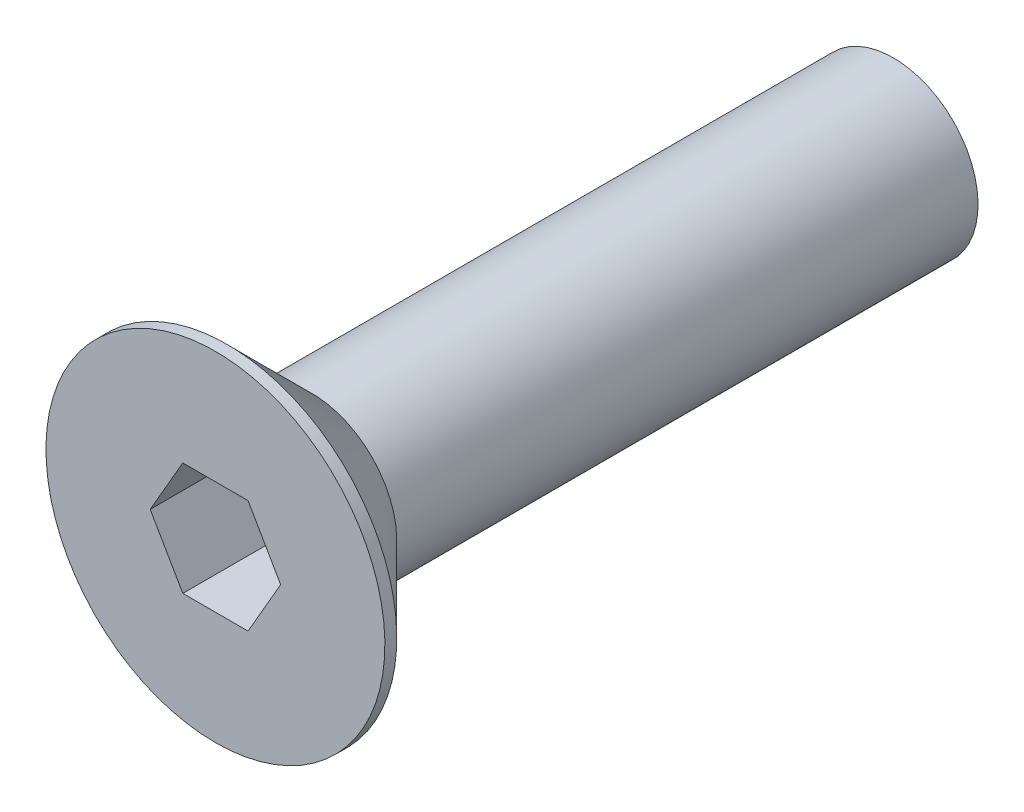
ISO-10303-21;
HEADER;
FILE_DESCRIPTION(('STEP AP214'),'2;1');
FILE_NAME('part.step','',(''),(''),'','','');
FILE_SCHEMA(('AUTOMOTIVE_DESIGN { 1 0 10303 214 1 1 1 1 }'));
ENDSEC;
DATA;
#1=APPLICATION_CONTEXT('core data for automotive mechanical design processes');
#2=APPLICATION_PROTOCOL_DEFINITION('international standard','automotive_design',2000,#1);
#3=PRODUCT_CONTEXT('',#1,'mechanical');
#4=PRODUCT('Part','Part','',(#3));
#5=PRODUCT_RELATED_PRODUCT_CATEGORY('part','',(#4));
#6=PRODUCT_DEFINITION_FORMATION('','',#4);
#7=PRODUCT_DEFINITION_CONTEXT('part definition',#1,'design');
#8=PRODUCT_DEFINITION('design','',#6,#7);
#9=PRODUCT_DEFINITION_SHAPE('','',#8);
#10=(LENGTH_UNIT() NAMED_UNIT(*) SI_UNIT(.MILLI.,.METRE.));
#11=(NAMED_UNIT(*) PLANE_ANGLE_UNIT() SI_UNIT($,.RADIAN.));
#12=(NAMED_UNIT(*) SI_UNIT($,.STERADIAN.) SOLID_ANGLE_UNIT());
#13=UNCERTAINTY_MEASURE_WITH_UNIT(LENGTH_MEASURE(1.E-05),#10,'distance_accuracy_value','');
#14=(GEOMETRIC_REPRESENTATION_CONTEXT(3) GLOBAL_UNCERTAINTY_ASSIGNED_CONTEXT((#13)) GLOBAL_UNIT_ASSIGNED_CONTEXT((#10,
#11,#12)) REPRESENTATION_CONTEXT('',''));
#15=CARTESIAN_POINT('',(0.,0.,0.));
#16=DIRECTION('',(0.,0.,1.));
#17=DIRECTION('',(1.,0.,0.));
#18=AXIS2_PLACEMENT_3D('',#15,#16,#17);
#19=CARTESIAN_POINT('',(0.,0.,1.7));
#20=DIRECTION('',(0.,0.,-1.));
#21=DIRECTION('',(0.,1.,0.));
#22=AXIS2_PLACEMENT_3D('',#19,#20,#21);
#23=PLANE('',#22);
#24=DIRECTION('',(0.5,0.866025403784439,0.));
#25=VECTOR('',#24,1.);
#26=CARTESIAN_POINT('',(0.577350269189626,-1.,1.7));
#27=LINE('',#26,#25);
#28=CARTESIAN_POINT('',(0.577350269189626,-1.,1.7));
#29=VERTEX_POINT('',#28);
#30=CARTESIAN_POINT('',(1.15470053837925,0.,1.7));
#31=VERTEX_POINT('',#30);
#32=EDGE_CURVE('E124',#29,#31,#27,.T.);
#33=ORIENTED_EDGE('',*,*,#32,.F.);
#34=DIRECTION('',(1.,0.,0.));
#35=VECTOR('',#34,1.);
#36=CARTESIAN_POINT('',(-0.577350269189626,-1.,1.7));
#37=LINE('',#36,#35);
#38=CARTESIAN_POINT('',(-0.577350269189626,-1.,1.7));
#39=VERTEX_POINT('',#38);
#40=EDGE_CURVE('E50',#39,#29,#37,.T.);
#41=ORIENTED_EDGE('',*,*,#40,.F.);
#42=DIRECTION('',(0.5,-0.866025403784439,0.));
#43=VECTOR('',#42,1.);
#44=CARTESIAN_POINT('',(-1.15470053837925,0.,1.7));
#45=LINE('',#44,#43);
#46=CARTESIAN_POINT('',(-1.15470053837925,0.,1.7));
#47=VERTEX_POINT('',#46);
#48=EDGE_CURVE('E133',#47,#39,#45,.T.);
#49=ORIENTED_EDGE('',*,*,#48,.F.);
#50=DIRECTION('',(-0.5,-0.866025403784439,0.));
#51=VECTOR('',#50,1.);
#52=CARTESIAN_POINT('',(-0.577350269189626,1.,1.7));
#53=LINE('',#52,#51);
#54=CARTESIAN_POINT('',(-0.577350269189626,1.,1.7));
#55=VERTEX_POINT('',#54);
#56=EDGE_CURVE('E131',#55,#47,#53,.T.);
#57=ORIENTED_EDGE('',*,*,#56,.F.);
#58=DIRECTION('',(-1.,0.,0.));
#59=VECTOR('',#58,1.);
#60=CARTESIAN_POINT('',(0.577350269189626,1.,1.7));
#61=LINE('',#60,#59);
#62=CARTESIAN_POINT('',(0.577350269189626,1.,1.7));
#63=VERTEX_POINT('',#62);
#64=EDGE_CURVE('E98',#63,#55,#61,.T.);
#65=ORIENTED_EDGE('',*,*,#64,.F.);
#66=DIRECTION('',(-0.5,0.866025403784439,0.));
#67=VECTOR('',#66,1.);
#68=CARTESIAN_POINT('',(1.15470053837925,0.,1.7));
#69=LINE('',#68,#67);
#70=EDGE_CURVE('E127',#31,#63,#69,.T.);
#71=ORIENTED_EDGE('',*,*,#70,.F.);
#72=EDGE_LOOP('',(#33,#41,#49,#57,#65,#71));
#73=FACE_BOUND('',#72,.T.);
#74=CARTESIAN_POINT('',(0.,0.,1.7));
#75=DIRECTION('',(0.,0.,1.));
#76=DIRECTION('',(0.,-1.,0.));
#77=AXIS2_PLACEMENT_3D('',#74,#75,#76);
#78=CIRCLE('',#77,3.);
#79=CARTESIAN_POINT('',(0.,-3.,1.7));
#80=VERTEX_POINT('',#79);
#81=EDGE_CURVE('E11',#80,#80,#78,.T.);
#82=ORIENTED_EDGE('',*,*,#81,.T.);
#83=EDGE_LOOP('',(#82));
#84=FACE_BOUND('',#83,.T.);
#85=ADVANCED_FACE('F36',(#73,#84),#23,.F.);
#86=CARTESIAN_POINT('',(0.,0.,5.58488227818494));
#87=DIRECTION('',(0.,0.,1.));
#88=DIRECTION('',(0.,-1.,0.));
#89=AXIS2_PLACEMENT_3D('',#86,#87,#88);
#90=CYLINDRICAL_SURFACE('',#89,3.);
#91=ORIENTED_EDGE('',*,*,#81,.F.);
#92=EDGE_LOOP('',(#91));
#93=FACE_BOUND('',#92,.T.);
#94=CARTESIAN_POINT('',(0.,0.,1.49000000000002));
#95=DIRECTION('',(0.,0.,1.));
#96=DIRECTION('',(0.,-1.,0.));
#97=AXIS2_PLACEMENT_3D('',#94,#95,#96);
#98=CIRCLE('',#97,3.);
#99=CARTESIAN_POINT('',(0.,-3.,1.49000000000002));
#100=VERTEX_POINT('',#99);
#101=EDGE_CURVE('E43',#100,#100,#98,.T.);
#102=ORIENTED_EDGE('',*,*,#101,.T.);
#103=EDGE_LOOP('',(#102));
#104=FACE_BOUND('',#103,.T.);
#105=ADVANCED_FACE('F153',(#93,#104),#90,.T.);
#106=CARTESIAN_POINT('',(0.,0.,0.));
#107=DIRECTION('',(0.,0.,1.));
#108=DIRECTION('',(0.,-1.,0.));
#109=AXIS2_PLACEMENT_3D('',#106,#107,#108);
#110=CONICAL_SURFACE('',#109,1.51,0.785398163397443);
#111=ORIENTED_EDGE('',*,*,#101,.F.);
#112=EDGE_LOOP('',(#111));
#113=FACE_BOUND('',#112,.T.);
#114=CARTESIAN_POINT('',(0.,0.,0.));
#115=DIRECTION('',(0.,0.,1.));
#116=DIRECTION('',(0.,-1.,0.));
#117=AXIS2_PLACEMENT_3D('',#114,#115,#116);
#118=CIRCLE('',#117,1.51);
#119=CARTESIAN_POINT('',(0.,-1.51,0.));
#120=VERTEX_POINT('',#119);
#121=EDGE_CURVE('E148',#120,#120,#118,.T.);
#122=ORIENTED_EDGE('',*,*,#121,.T.);
#123=EDGE_LOOP('',(#122));
#124=FACE_BOUND('',#123,.T.);
#125=ADVANCED_FACE('F155',(#113,#124),#110,.T.);
#126=CARTESIAN_POINT('',(0.,1.51,0.));
#127=DIRECTION('',(0.,0.,1.));
#128=DIRECTION('',(0.,-1.,0.));
#129=AXIS2_PLACEMENT_3D('',#126,#127,#128);
#130=PLANE('',#129);
#131=ORIENTED_EDGE('',*,*,#121,.F.);
#132=EDGE_LOOP('',(#131));
#133=FACE_BOUND('',#132,.T.);
#134=CARTESIAN_POINT('',(0.,0.,0.));
#135=DIRECTION('',(0.,0.,1.));
#136=DIRECTION('',(0.,-1.,0.));
#137=AXIS2_PLACEMENT_3D('',#134,#135,#136);
#138=CIRCLE('',#137,1.5);
#139=CARTESIAN_POINT('',(0.,-1.5,0.));
#140=VERTEX_POINT('',#139);
#141=EDGE_CURVE('E145',#140,#140,#138,.T.);
#142=ORIENTED_EDGE('',*,*,#141,.T.);
#143=EDGE_LOOP('',(#142));
#144=FACE_BOUND('',#143,.T.);
#145=ADVANCED_FACE('F158',(#133,#144),#130,.F.);
#146=CARTESIAN_POINT('',(0.,0.,5.58488227818494));
#147=DIRECTION('',(0.,0.,1.));
#148=DIRECTION('',(0.,-1.,0.));
#149=AXIS2_PLACEMENT_3D('',#146,#147,#148);
#150=CYLINDRICAL_SURFACE('',#149,1.5);
#151=ORIENTED_EDGE('',*,*,#141,.F.);
#152=EDGE_LOOP('',(#151));
#153=FACE_BOUND('',#152,.T.);
#154=CARTESIAN_POINT('',(0.,0.,-10.3));
#155=DIRECTION('',(0.,0.,1.));
#156=DIRECTION('',(0.,-1.,0.));
#157=AXIS2_PLACEMENT_3D('',#154,#155,#156);
#158=CIRCLE('',#157,1.5);
#159=CARTESIAN_POINT('',(0.,-1.5,-10.3));
#160=VERTEX_POINT('',#159);
#161=EDGE_CURVE('E137',#160,#160,#158,.T.);
#162=ORIENTED_EDGE('',*,*,#161,.T.);
#163=EDGE_LOOP('',(#162));
#164=FACE_BOUND('',#163,.T.);
#165=ADVANCED_FACE('F164',(#153,#164),#150,.T.);
#166=CARTESIAN_POINT('',(0.,1.5,-10.3));
#167=DIRECTION('',(0.,0.,1.));
#168=DIRECTION('',(0.,-1.,0.));
#169=AXIS2_PLACEMENT_3D('',#166,#167,#168);
#170=PLANE('',#169);
#171=ORIENTED_EDGE('',*,*,#161,.F.);
#172=EDGE_LOOP('',(#171));
#173=FACE_BOUND('',#172,.T.);
#174=ADVANCED_FACE('F170',(#173),#170,.F.);
#175=CARTESIAN_POINT('',(-0.577350269189626,-1.,0.2));
#176=DIRECTION('',(0.,-1.,0.));
#177=DIRECTION('',(1.,0.,0.));
#178=AXIS2_PLACEMENT_3D('',#175,#176,#177);
#179=PLANE('',#178);
#180=ORIENTED_EDGE('',*,*,#40,.T.);
#181=DIRECTION('',(0.,0.,1.));
#182=VECTOR('',#181,1.);
#183=CARTESIAN_POINT('',(0.577350269189626,-1.,0.2));
#184=LINE('',#183,#182);
#185=CARTESIAN_POINT('',(0.577350269189626,-1.,0.2));
#186=VERTEX_POINT('',#185);
#187=EDGE_CURVE('E80',#186,#29,#184,.T.);
#188=ORIENTED_EDGE('',*,*,#187,.F.);
#189=DIRECTION('',(1.,0.,0.));
#190=VECTOR('',#189,1.);
#191=CARTESIAN_POINT('',(-0.577350269189626,-1.,0.2));
#192=LINE('',#191,#190);
#193=CARTESIAN_POINT('',(-0.577350269189626,-1.,0.2));
#194=VERTEX_POINT('',#193);
#195=EDGE_CURVE('E135',#194,#186,#192,.T.);
#196=ORIENTED_EDGE('',*,*,#195,.F.);
#197=DIRECTION('',(0.,0.,1.));
#198=VECTOR('',#197,1.);
#199=CARTESIAN_POINT('',(-0.577350269189626,-1.,0.2));
#200=LINE('',#199,#198);
#201=EDGE_CURVE('E58',#194,#39,#200,.T.);
#202=ORIENTED_EDGE('',*,*,#201,.T.);
#203=EDGE_LOOP('',(#180,#188,#196,#202));
#204=FACE_BOUND('',#203,.T.);
#205=ADVANCED_FACE('F175',(#204),#179,.F.);
#206=CARTESIAN_POINT('',(-1.15470053837925,0.,0.2));
#207=DIRECTION('',(-0.866025403784439,-0.5,0.));
#208=DIRECTION('',(0.5,-0.866025403784439,0.));
#209=AXIS2_PLACEMENT_3D('',#206,#207,#208);
#210=PLANE('',#209);
#211=ORIENTED_EDGE('',*,*,#48,.T.);
#212=ORIENTED_EDGE('',*,*,#201,.F.);
#213=DIRECTION('',(0.5,-0.866025403784439,0.));
#214=VECTOR('',#213,1.);
#215=CARTESIAN_POINT('',(-1.15470053837925,0.,0.2));
#216=LINE('',#215,#214);
#217=CARTESIAN_POINT('',(-1.15470053837925,0.,0.2));
#218=VERTEX_POINT('',#217);
#219=EDGE_CURVE('E110',#218,#194,#216,.T.);
#220=ORIENTED_EDGE('',*,*,#219,.F.);
#221=DIRECTION('',(0.,0.,1.));
#222=VECTOR('',#221,1.);
#223=CARTESIAN_POINT('',(-1.15470053837925,0.,0.2));
#224=LINE('',#223,#222);
#225=EDGE_CURVE('E102',#218,#47,#224,.T.);
#226=ORIENTED_EDGE('',*,*,#225,.T.);
#227=EDGE_LOOP('',(#211,#212,#220,#226));
#228=FACE_BOUND('',#227,.T.);
#229=ADVANCED_FACE('F180',(#228),#210,.F.);
#230=CARTESIAN_POINT('',(-0.577350269189626,1.,0.2));
#231=DIRECTION('',(-0.866025403784439,0.5,0.));
#232=DIRECTION('',(-0.5,-0.866025403784439,0.));
#233=AXIS2_PLACEMENT_3D('',#230,#231,#232);
#234=PLANE('',#233);
#235=ORIENTED_EDGE('',*,*,#56,.T.);
#236=ORIENTED_EDGE('',*,*,#225,.F.);
#237=DIRECTION('',(-0.5,-0.866025403784439,0.));
#238=VECTOR('',#237,1.);
#239=CARTESIAN_POINT('',(-0.577350269189626,1.,0.2));
#240=LINE('',#239,#238);
#241=CARTESIAN_POINT('',(-0.577350269189626,1.,0.2));
#242=VERTEX_POINT('',#241);
#243=EDGE_CURVE('E106',#242,#218,#240,.T.);
#244=ORIENTED_EDGE('',*,*,#243,.F.);
#245=DIRECTION('',(0.,0.,1.));
#246=VECTOR('',#245,1.);
#247=CARTESIAN_POINT('',(-0.577350269189626,1.,0.2));
#248=LINE('',#247,#246);
#249=EDGE_CURVE('E91',#242,#55,#248,.T.);
#250=ORIENTED_EDGE('',*,*,#249,.T.);
#251=EDGE_LOOP('',(#235,#236,#244,#250));
#252=FACE_BOUND('',#251,.T.);
#253=ADVANCED_FACE('F107',(#252),#234,.F.);
#254=CARTESIAN_POINT('',(0.577350269189626,1.,0.2));
#255=DIRECTION('',(0.,1.,0.));
#256=DIRECTION('',(0.,0.,1.));
#257=AXIS2_PLACEMENT_3D('',#254,#255,#256);
#258=PLANE('',#257);
#259=ORIENTED_EDGE('',*,*,#64,.T.);
#260=ORIENTED_EDGE('',*,*,#249,.F.);
#261=DIRECTION('',(-1.,0.,0.));
#262=VECTOR('',#261,1.);
#263=CARTESIAN_POINT('',(0.577350269189626,1.,0.2));
#264=LINE('',#263,#262);
#265=CARTESIAN_POINT('',(0.577350269189626,1.,0.2));
#266=VERTEX_POINT('',#265);
#267=EDGE_CURVE('E95',#266,#242,#264,.T.);
#268=ORIENTED_EDGE('',*,*,#267,.F.);
#269=DIRECTION('',(0.,0.,1.));
#270=VECTOR('',#269,1.);
#271=CARTESIAN_POINT('',(0.577350269189626,1.,0.2));
#272=LINE('',#271,#270);
#273=EDGE_CURVE('E103',#266,#63,#272,.T.);
#274=ORIENTED_EDGE('',*,*,#273,.T.);
#275=EDGE_LOOP('',(#259,#260,#268,#274));
#276=FACE_BOUND('',#275,.T.);
#277=ADVANCED_FACE('F93',(#276),#258,.F.);
#278=CARTESIAN_POINT('',(1.15470053837925,0.,0.2));
#279=DIRECTION('',(0.866025403784439,0.5,0.));
#280=DIRECTION('',(-0.5,0.866025403784439,0.));
#281=AXIS2_PLACEMENT_3D('',#278,#279,#280);
#282=PLANE('',#281);
#283=ORIENTED_EDGE('',*,*,#70,.T.);
#284=ORIENTED_EDGE('',*,*,#273,.F.);
#285=DIRECTION('',(-0.5,0.866025403784439,0.));
#286=VECTOR('',#285,1.);
#287=CARTESIAN_POINT('',(1.15470053837925,0.,0.2));
#288=LINE('',#287,#286);
#289=CARTESIAN_POINT('',(1.15470053837925,0.,0.2));
#290=VERTEX_POINT('',#289);
#291=EDGE_CURVE('E116',#290,#266,#288,.T.);
#292=ORIENTED_EDGE('',*,*,#291,.F.);
#293=DIRECTION('',(0.,0.,1.));
#294=VECTOR('',#293,1.);
#295=CARTESIAN_POINT('',(1.15470053837925,0.,0.2));
#296=LINE('',#295,#294);
#297=EDGE_CURVE('E140',#290,#31,#296,.T.);
#298=ORIENTED_EDGE('',*,*,#297,.T.);
#299=EDGE_LOOP('',(#283,#284,#292,#298));
#300=FACE_BOUND('',#299,.T.);
#301=ADVANCED_FACE('F206',(#300),#282,.F.);
#302=CARTESIAN_POINT('',(0.577350269189626,-1.,0.2));
#303=DIRECTION('',(0.866025403784439,-0.5,0.));
#304=DIRECTION('',(0.5,0.866025403784439,0.));
#305=AXIS2_PLACEMENT_3D('',#302,#303,#304);
#306=PLANE('',#305);
#307=ORIENTED_EDGE('',*,*,#32,.T.);
#308=ORIENTED_EDGE('',*,*,#297,.F.);
#309=DIRECTION('',(0.5,0.866025403784439,0.));
#310=VECTOR('',#309,1.);
#311=CARTESIAN_POINT('',(0.577350269189626,-1.,0.2));
#312=LINE('',#311,#310);
#313=EDGE_CURVE('E118',#186,#290,#312,.T.);
#314=ORIENTED_EDGE('',*,*,#313,.F.);
#315=ORIENTED_EDGE('',*,*,#187,.T.);
#316=EDGE_LOOP('',(#307,#308,#314,#315));
#317=FACE_BOUND('',#316,.T.);
#318=ADVANCED_FACE('F194',(#317),#306,.F.);
#319=CARTESIAN_POINT('',(-0.577350269189626,-1.,0.2));
#320=DIRECTION('',(0.,0.,-1.));
#321=DIRECTION('',(-1.,0.,0.));
#322=AXIS2_PLACEMENT_3D('',#319,#320,#321);
#323=PLANE('',#322);
#324=ORIENTED_EDGE('',*,*,#195,.T.);
#325=ORIENTED_EDGE('',*,*,#313,.T.);
#326=ORIENTED_EDGE('',*,*,#291,.T.);
#327=ORIENTED_EDGE('',*,*,#267,.T.);
#328=ORIENTED_EDGE('',*,*,#243,.T.);
#329=ORIENTED_EDGE('',*,*,#219,.T.);
#330=EDGE_LOOP('',(#324,#325,#326,#327,#328,#329));
#331=FACE_BOUND('',#330,.T.);
#332=ADVANCED_FACE('F113',(#331),#323,.F.);
#333=CLOSED_SHELL('',(#85,#105,#125,#145,#165,#174,#205,#229,#253,#277,#301,#318,#332));
#334=MANIFOLD_SOLID_BREP('B2',#333);
#335=ADVANCED_BREP_SHAPE_REPRESENTATION('',(#18,#334),#14);
#336=SHAPE_DEFINITION_REPRESENTATION(#9,#335);
ENDSEC;
END-ISO-10303-21;
